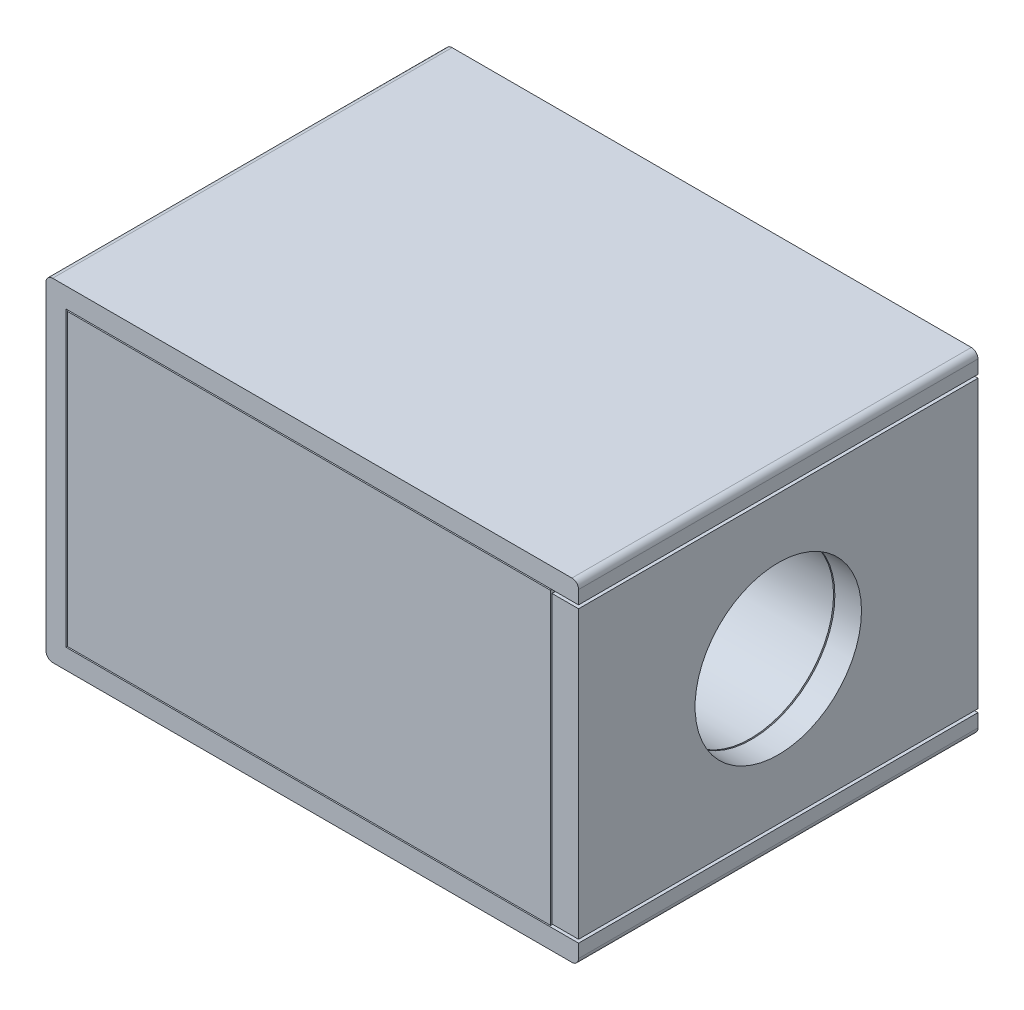
ISO-10303-21;
HEADER;
FILE_DESCRIPTION(('STEP AP214'),'2;1');
FILE_NAME('part.step','',(''),(''),'','','');
FILE_SCHEMA(('AUTOMOTIVE_DESIGN { 1 0 10303 214 1 1 1 1 }'));
ENDSEC;
DATA;
#1=APPLICATION_CONTEXT('core data for automotive mechanical design processes');
#2=APPLICATION_PROTOCOL_DEFINITION('international standard','automotive_design',2000,#1);
#3=PRODUCT_CONTEXT('',#1,'mechanical');
#4=PRODUCT('Part','Part','',(#3));
#5=PRODUCT_RELATED_PRODUCT_CATEGORY('part','',(#4));
#6=PRODUCT_DEFINITION_FORMATION('','',#4);
#7=PRODUCT_DEFINITION_CONTEXT('part definition',#1,'design');
#8=PRODUCT_DEFINITION('design','',#6,#7);
#9=PRODUCT_DEFINITION_SHAPE('','',#8);
#10=(LENGTH_UNIT() NAMED_UNIT(*) SI_UNIT(.MILLI.,.METRE.));
#11=(NAMED_UNIT(*) PLANE_ANGLE_UNIT() SI_UNIT($,.RADIAN.));
#12=(NAMED_UNIT(*) SI_UNIT($,.STERADIAN.) SOLID_ANGLE_UNIT());
#13=UNCERTAINTY_MEASURE_WITH_UNIT(LENGTH_MEASURE(1.E-05),#10,'distance_accuracy_value','');
#14=(GEOMETRIC_REPRESENTATION_CONTEXT(3) GLOBAL_UNCERTAINTY_ASSIGNED_CONTEXT((#13)) GLOBAL_UNIT_ASSIGNED_CONTEXT((#10,
#11,#12)) REPRESENTATION_CONTEXT('',''));
#15=CARTESIAN_POINT('',(0.,0.,0.));
#16=DIRECTION('',(0.,0.,1.));
#17=DIRECTION('',(1.,0.,0.));
#18=AXIS2_PLACEMENT_3D('',#15,#16,#17);
#19=CARTESIAN_POINT('',(79.,-24.,0.));
#20=DIRECTION('',(0.,0.,-1.));
#21=DIRECTION('',(-1.,0.,0.));
#22=AXIS2_PLACEMENT_3D('',#19,#20,#21);
#23=PLANE('',#22);
#24=DIRECTION('',(0.,-1.,0.));
#25=VECTOR('',#24,1.);
#26=CARTESIAN_POINT('',(3.2,21.8,0.));
#27=LINE('',#26,#25);
#28=CARTESIAN_POINT('',(3.2,21.8,0.));
#29=VERTEX_POINT('',#28);
#30=CARTESIAN_POINT('',(3.20000000000001,-21.8,0.));
#31=VERTEX_POINT('',#30);
#32=EDGE_CURVE('E56',#29,#31,#27,.T.);
#33=ORIENTED_EDGE('',*,*,#32,.F.);
#34=DIRECTION('',(-1.,0.,0.));
#35=VECTOR('',#34,1.);
#36=CARTESIAN_POINT('',(3.2,21.8,0.));
#37=LINE('',#36,#35);
#38=CARTESIAN_POINT('',(75.8,21.8,0.));
#39=VERTEX_POINT('',#38);
#40=EDGE_CURVE('E80',#39,#29,#37,.T.);
#41=ORIENTED_EDGE('',*,*,#40,.F.);
#42=DIRECTION('',(0.,1.,0.));
#43=VECTOR('',#42,1.);
#44=CARTESIAN_POINT('',(75.8,21.8,0.));
#45=LINE('',#44,#43);
#46=CARTESIAN_POINT('',(75.8,-21.8,0.));
#47=VERTEX_POINT('',#46);
#48=EDGE_CURVE('E85',#47,#39,#45,.T.);
#49=ORIENTED_EDGE('',*,*,#48,.F.);
#50=DIRECTION('',(1.,0.,0.));
#51=VECTOR('',#50,1.);
#52=CARTESIAN_POINT('',(3.20000000000001,-21.8,0.));
#53=LINE('',#52,#51);
#54=EDGE_CURVE('E100',#31,#47,#53,.T.);
#55=ORIENTED_EDGE('',*,*,#54,.F.);
#56=EDGE_LOOP('',(#33,#41,#49,#55));
#57=FACE_BOUND('',#56,.T.);
#58=ADVANCED_FACE('F47',(#57),#23,.T.);
#59=CARTESIAN_POINT('',(0.,0.,60.));
#60=DIRECTION('',(0.,0.,1.));
#61=DIRECTION('',(1.,0.,0.));
#62=AXIS2_PLACEMENT_3D('',#59,#60,#61);
#63=PLANE('',#62);
#64=DIRECTION('',(0.,-1.,0.));
#65=VECTOR('',#64,1.);
#66=CARTESIAN_POINT('',(3.2,21.8,60.));
#67=LINE('',#66,#65);
#68=CARTESIAN_POINT('',(3.2,21.8,60.));
#69=VERTEX_POINT('',#68);
#70=CARTESIAN_POINT('',(3.20000000000001,-21.8,60.));
#71=VERTEX_POINT('',#70);
#72=EDGE_CURVE('E110',#69,#71,#67,.T.);
#73=ORIENTED_EDGE('',*,*,#72,.T.);
#74=DIRECTION('',(1.,0.,0.));
#75=VECTOR('',#74,1.);
#76=CARTESIAN_POINT('',(3.20000000000001,-21.8,60.));
#77=LINE('',#76,#75);
#78=CARTESIAN_POINT('',(75.8,-21.8,60.));
#79=VERTEX_POINT('',#78);
#80=EDGE_CURVE('E98',#71,#79,#77,.T.);
#81=ORIENTED_EDGE('',*,*,#80,.T.);
#82=DIRECTION('',(0.,1.,0.));
#83=VECTOR('',#82,1.);
#84=CARTESIAN_POINT('',(75.8,21.8,60.));
#85=LINE('',#84,#83);
#86=CARTESIAN_POINT('',(75.8,21.8,60.));
#87=VERTEX_POINT('',#86);
#88=EDGE_CURVE('E102',#79,#87,#85,.T.);
#89=ORIENTED_EDGE('',*,*,#88,.T.);
#90=DIRECTION('',(-1.,0.,0.));
#91=VECTOR('',#90,1.);
#92=CARTESIAN_POINT('',(3.2,21.8,60.));
#93=LINE('',#92,#91);
#94=EDGE_CURVE('E107',#87,#69,#93,.T.);
#95=ORIENTED_EDGE('',*,*,#94,.T.);
#96=EDGE_LOOP('',(#73,#81,#89,#95));
#97=FACE_BOUND('',#96,.T.);
#98=ADVANCED_FACE('F109',(#97),#63,.T.);
#99=CARTESIAN_POINT('',(3.20000000000001,-21.8,-84.6860082894453));
#100=DIRECTION('',(0.,-1.,0.));
#101=DIRECTION('',(0.,0.,-1.));
#102=AXIS2_PLACEMENT_3D('',#99,#100,#101);
#103=PLANE('',#102);
#104=CARTESIAN_POINT('',(17.,-21.8,48.5));
#105=DIRECTION('',(0.,-1.,0.));
#106=DIRECTION('',(0.,0.,-1.));
#107=AXIS2_PLACEMENT_3D('',#104,#105,#106);
#108=CIRCLE('',#107,2.);
#109=CARTESIAN_POINT('',(17.,-21.8,46.5));
#110=VERTEX_POINT('',#109);
#111=EDGE_CURVE('E112',#110,#110,#108,.T.);
#112=ORIENTED_EDGE('',*,*,#111,.F.);
#113=EDGE_LOOP('',(#112));
#114=FACE_BOUND('',#113,.T.);
#115=CARTESIAN_POINT('',(45.,-21.8,48.5));
#116=DIRECTION('',(0.,-1.,0.));
#117=DIRECTION('',(0.,0.,-1.));
#118=AXIS2_PLACEMENT_3D('',#115,#116,#117);
#119=CIRCLE('',#118,2.);
#120=CARTESIAN_POINT('',(45.,-21.8,46.5));
#121=VERTEX_POINT('',#120);
#122=EDGE_CURVE('E130',#121,#121,#119,.T.);
#123=ORIENTED_EDGE('',*,*,#122,.F.);
#124=EDGE_LOOP('',(#123));
#125=FACE_BOUND('',#124,.T.);
#126=CARTESIAN_POINT('',(45.,-21.8,11.5));
#127=DIRECTION('',(0.,-1.,0.));
#128=DIRECTION('',(0.,0.,-1.));
#129=AXIS2_PLACEMENT_3D('',#126,#127,#128);
#130=CIRCLE('',#129,2.);
#131=CARTESIAN_POINT('',(45.,-21.8,9.5));
#132=VERTEX_POINT('',#131);
#133=EDGE_CURVE('E126',#132,#132,#130,.T.);
#134=ORIENTED_EDGE('',*,*,#133,.F.);
#135=EDGE_LOOP('',(#134));
#136=FACE_BOUND('',#135,.T.);
#137=CARTESIAN_POINT('',(17.,-21.8,11.5));
#138=DIRECTION('',(0.,-1.,0.));
#139=DIRECTION('',(0.,0.,-1.));
#140=AXIS2_PLACEMENT_3D('',#137,#138,#139);
#141=CIRCLE('',#140,2.);
#142=CARTESIAN_POINT('',(17.,-21.8,9.5));
#143=VERTEX_POINT('',#142);
#144=EDGE_CURVE('E123',#143,#143,#141,.T.);
#145=ORIENTED_EDGE('',*,*,#144,.F.);
#146=EDGE_LOOP('',(#145));
#147=FACE_BOUND('',#146,.T.);
#148=DIRECTION('',(0.,0.,1.));
#149=VECTOR('',#148,1.);
#150=CARTESIAN_POINT('',(3.20000000000001,-21.8,-84.6860082894453));
#151=LINE('',#150,#149);
#152=EDGE_CURVE('E12',#31,#71,#151,.T.);
#153=ORIENTED_EDGE('',*,*,#152,.F.);
#154=ORIENTED_EDGE('',*,*,#54,.T.);
#155=DIRECTION('',(0.,0.,1.));
#156=VECTOR('',#155,1.);
#157=CARTESIAN_POINT('',(75.8,-21.8,-84.6860082894453));
#158=LINE('',#157,#156);
#159=EDGE_CURVE('E95',#47,#79,#158,.T.);
#160=ORIENTED_EDGE('',*,*,#159,.T.);
#161=ORIENTED_EDGE('',*,*,#80,.F.);
#162=EDGE_LOOP('',(#153,#154,#160,#161));
#163=FACE_BOUND('',#162,.T.);
#164=ADVANCED_FACE('F96',(#114,#125,#136,#147,#163),#103,.T.);
#165=CARTESIAN_POINT('',(75.8,21.8,-84.6860082894453));
#166=DIRECTION('',(1.,0.,0.));
#167=DIRECTION('',(0.,0.,-1.));
#168=AXIS2_PLACEMENT_3D('',#165,#166,#167);
#169=PLANE('',#168);
#170=CARTESIAN_POINT('',(75.8,0.,30.));
#171=DIRECTION('',(1.,0.,0.));
#172=DIRECTION('',(0.,0.,-1.));
#173=AXIS2_PLACEMENT_3D('',#170,#171,#172);
#174=CIRCLE('',#173,12.5);
#175=CARTESIAN_POINT('',(75.8,0.,17.5));
#176=VERTEX_POINT('',#175);
#177=EDGE_CURVE('E134',#176,#176,#174,.T.);
#178=ORIENTED_EDGE('',*,*,#177,.F.);
#179=EDGE_LOOP('',(#178));
#180=FACE_BOUND('',#179,.T.);
#181=ORIENTED_EDGE('',*,*,#159,.F.);
#182=ORIENTED_EDGE('',*,*,#48,.T.);
#183=DIRECTION('',(0.,0.,1.));
#184=VECTOR('',#183,1.);
#185=CARTESIAN_POINT('',(75.8,21.8,-84.6860082894453));
#186=LINE('',#185,#184);
#187=EDGE_CURVE('E90',#39,#87,#186,.T.);
#188=ORIENTED_EDGE('',*,*,#187,.T.);
#189=ORIENTED_EDGE('',*,*,#88,.F.);
#190=EDGE_LOOP('',(#181,#182,#188,#189));
#191=FACE_BOUND('',#190,.T.);
#192=ADVANCED_FACE('F103',(#180,#191),#169,.T.);
#193=CARTESIAN_POINT('',(3.2,21.8,-84.6860082894453));
#194=DIRECTION('',(0.,1.,0.));
#195=DIRECTION('',(0.,0.,1.));
#196=AXIS2_PLACEMENT_3D('',#193,#194,#195);
#197=PLANE('',#196);
#198=ORIENTED_EDGE('',*,*,#187,.F.);
#199=ORIENTED_EDGE('',*,*,#40,.T.);
#200=DIRECTION('',(0.,0.,1.));
#201=VECTOR('',#200,1.);
#202=CARTESIAN_POINT('',(3.2,21.8,-84.6860082894453));
#203=LINE('',#202,#201);
#204=EDGE_CURVE('E118',#29,#69,#203,.T.);
#205=ORIENTED_EDGE('',*,*,#204,.T.);
#206=ORIENTED_EDGE('',*,*,#94,.F.);
#207=EDGE_LOOP('',(#198,#199,#205,#206));
#208=FACE_BOUND('',#207,.T.);
#209=ADVANCED_FACE('F158',(#208),#197,.T.);
#210=CARTESIAN_POINT('',(3.2,21.8,-84.6860082894453));
#211=DIRECTION('',(-1.,0.,0.));
#212=DIRECTION('',(0.,-1.,0.));
#213=AXIS2_PLACEMENT_3D('',#210,#211,#212);
#214=PLANE('',#213);
#215=CARTESIAN_POINT('',(3.2,0.,30.));
#216=DIRECTION('',(-1.,0.,0.));
#217=DIRECTION('',(0.,-1.,0.));
#218=AXIS2_PLACEMENT_3D('',#215,#216,#217);
#219=CIRCLE('',#218,5.);
#220=CARTESIAN_POINT('',(3.2,-5.,30.));
#221=VERTEX_POINT('',#220);
#222=EDGE_CURVE('E144',#221,#221,#219,.T.);
#223=ORIENTED_EDGE('',*,*,#222,.F.);
#224=EDGE_LOOP('',(#223));
#225=FACE_BOUND('',#224,.T.);
#226=ORIENTED_EDGE('',*,*,#204,.F.);
#227=ORIENTED_EDGE('',*,*,#32,.T.);
#228=ORIENTED_EDGE('',*,*,#152,.T.);
#229=ORIENTED_EDGE('',*,*,#72,.F.);
#230=EDGE_LOOP('',(#226,#227,#228,#229));
#231=FACE_BOUND('',#230,.T.);
#232=ADVANCED_FACE('F160',(#225,#231),#214,.T.);
#233=CARTESIAN_POINT('',(17.,3.00000000000001,11.5));
#234=DIRECTION('',(0.,-1.,0.));
#235=DIRECTION('',(1.,0.,0.));
#236=AXIS2_PLACEMENT_3D('',#233,#234,#235);
#237=CYLINDRICAL_SURFACE('',#236,2.);
#238=ORIENTED_EDGE('',*,*,#144,.T.);
#239=EDGE_LOOP('',(#238));
#240=FACE_BOUND('',#239,.T.);
#241=CARTESIAN_POINT('',(17.,3.00000000000001,11.5));
#242=DIRECTION('',(0.,-1.,0.));
#243=DIRECTION('',(1.,0.,0.));
#244=AXIS2_PLACEMENT_3D('',#241,#242,#243);
#245=CIRCLE('',#244,2.);
#246=CARTESIAN_POINT('',(19.,3.00000000000001,11.5));
#247=VERTEX_POINT('',#246);
#248=EDGE_CURVE('E136',#247,#247,#245,.T.);
#249=ORIENTED_EDGE('',*,*,#248,.F.);
#250=EDGE_LOOP('',(#249));
#251=FACE_BOUND('',#250,.T.);
#252=ADVANCED_FACE('F162',(#240,#251),#237,.F.);
#253=CARTESIAN_POINT('',(17.,3.00000000000001,11.5));
#254=DIRECTION('',(0.,-1.,0.));
#255=DIRECTION('',(1.,0.,0.));
#256=AXIS2_PLACEMENT_3D('',#253,#254,#255);
#257=PLANE('',#256);
#258=ORIENTED_EDGE('',*,*,#248,.T.);
#259=EDGE_LOOP('',(#258));
#260=FACE_BOUND('',#259,.T.);
#261=ADVANCED_FACE('F169',(#260),#257,.T.);
#262=CARTESIAN_POINT('',(45.,3.00000000000001,11.5));
#263=DIRECTION('',(0.,-1.,0.));
#264=DIRECTION('',(1.,0.,0.));
#265=AXIS2_PLACEMENT_3D('',#262,#263,#264);
#266=CYLINDRICAL_SURFACE('',#265,2.);
#267=ORIENTED_EDGE('',*,*,#133,.T.);
#268=EDGE_LOOP('',(#267));
#269=FACE_BOUND('',#268,.T.);
#270=CARTESIAN_POINT('',(45.,3.00000000000001,11.5));
#271=DIRECTION('',(0.,-1.,0.));
#272=DIRECTION('',(1.,0.,0.));
#273=AXIS2_PLACEMENT_3D('',#270,#271,#272);
#274=CIRCLE('',#273,2.);
#275=CARTESIAN_POINT('',(47.,3.00000000000001,11.5));
#276=VERTEX_POINT('',#275);
#277=EDGE_CURVE('E141',#276,#276,#274,.T.);
#278=ORIENTED_EDGE('',*,*,#277,.F.);
#279=EDGE_LOOP('',(#278));
#280=FACE_BOUND('',#279,.T.);
#281=ADVANCED_FACE('F186',(#269,#280),#266,.F.);
#282=CARTESIAN_POINT('',(45.,3.00000000000001,11.5));
#283=DIRECTION('',(0.,-1.,0.));
#284=DIRECTION('',(1.,0.,0.));
#285=AXIS2_PLACEMENT_3D('',#282,#283,#284);
#286=PLANE('',#285);
#287=ORIENTED_EDGE('',*,*,#277,.T.);
#288=EDGE_LOOP('',(#287));
#289=FACE_BOUND('',#288,.T.);
#290=ADVANCED_FACE('F190',(#289),#286,.T.);
#291=CARTESIAN_POINT('',(45.,3.00000000000001,48.5));
#292=DIRECTION('',(0.,-1.,0.));
#293=DIRECTION('',(1.,0.,0.));
#294=AXIS2_PLACEMENT_3D('',#291,#292,#293);
#295=CYLINDRICAL_SURFACE('',#294,2.);
#296=ORIENTED_EDGE('',*,*,#122,.T.);
#297=EDGE_LOOP('',(#296));
#298=FACE_BOUND('',#297,.T.);
#299=CARTESIAN_POINT('',(45.,3.00000000000001,48.5));
#300=DIRECTION('',(0.,-1.,0.));
#301=DIRECTION('',(1.,0.,0.));
#302=AXIS2_PLACEMENT_3D('',#299,#300,#301);
#303=CIRCLE('',#302,2.);
#304=CARTESIAN_POINT('',(47.,3.00000000000001,48.5));
#305=VERTEX_POINT('',#304);
#306=EDGE_CURVE('E153',#305,#305,#303,.T.);
#307=ORIENTED_EDGE('',*,*,#306,.F.);
#308=EDGE_LOOP('',(#307));
#309=FACE_BOUND('',#308,.T.);
#310=ADVANCED_FACE('F194',(#298,#309),#295,.F.);
#311=CARTESIAN_POINT('',(45.,3.00000000000001,48.5));
#312=DIRECTION('',(0.,-1.,0.));
#313=DIRECTION('',(1.,0.,0.));
#314=AXIS2_PLACEMENT_3D('',#311,#312,#313);
#315=PLANE('',#314);
#316=ORIENTED_EDGE('',*,*,#306,.T.);
#317=EDGE_LOOP('',(#316));
#318=FACE_BOUND('',#317,.T.);
#319=ADVANCED_FACE('F198',(#318),#315,.T.);
#320=CARTESIAN_POINT('',(17.,3.00000000000001,48.5));
#321=DIRECTION('',(0.,-1.,0.));
#322=DIRECTION('',(1.,0.,0.));
#323=AXIS2_PLACEMENT_3D('',#320,#321,#322);
#324=CYLINDRICAL_SURFACE('',#323,2.);
#325=ORIENTED_EDGE('',*,*,#111,.T.);
#326=EDGE_LOOP('',(#325));
#327=FACE_BOUND('',#326,.T.);
#328=CARTESIAN_POINT('',(17.,3.00000000000001,48.5));
#329=DIRECTION('',(0.,-1.,0.));
#330=DIRECTION('',(1.,0.,0.));
#331=AXIS2_PLACEMENT_3D('',#328,#329,#330);
#332=CIRCLE('',#331,2.);
#333=CARTESIAN_POINT('',(19.,3.00000000000001,48.5));
#334=VERTEX_POINT('',#333);
#335=EDGE_CURVE('E127',#334,#334,#332,.T.);
#336=ORIENTED_EDGE('',*,*,#335,.F.);
#337=EDGE_LOOP('',(#336));
#338=FACE_BOUND('',#337,.T.);
#339=ADVANCED_FACE('F202',(#327,#338),#324,.F.);
#340=CARTESIAN_POINT('',(17.,3.00000000000001,48.5));
#341=DIRECTION('',(0.,-1.,0.));
#342=DIRECTION('',(1.,0.,0.));
#343=AXIS2_PLACEMENT_3D('',#340,#341,#342);
#344=PLANE('',#343);
#345=ORIENTED_EDGE('',*,*,#335,.T.);
#346=EDGE_LOOP('',(#345));
#347=FACE_BOUND('',#346,.T.);
#348=ADVANCED_FACE('F206',(#347),#344,.T.);
#349=CARTESIAN_POINT('',(20.,0.,30.));
#350=DIRECTION('',(1.,0.,0.));
#351=DIRECTION('',(0.,0.,-1.));
#352=AXIS2_PLACEMENT_3D('',#349,#350,#351);
#353=CYLINDRICAL_SURFACE('',#352,12.5);
#354=ORIENTED_EDGE('',*,*,#177,.T.);
#355=EDGE_LOOP('',(#354));
#356=FACE_BOUND('',#355,.T.);
#357=CARTESIAN_POINT('',(20.,0.,30.));
#358=DIRECTION('',(1.,0.,0.));
#359=DIRECTION('',(0.,0.,-1.));
#360=AXIS2_PLACEMENT_3D('',#357,#358,#359);
#361=CIRCLE('',#360,12.5);
#362=CARTESIAN_POINT('',(20.,0.,17.5));
#363=VERTEX_POINT('',#362);
#364=EDGE_CURVE('E137',#363,#363,#361,.T.);
#365=ORIENTED_EDGE('',*,*,#364,.F.);
#366=EDGE_LOOP('',(#365));
#367=FACE_BOUND('',#366,.T.);
#368=ADVANCED_FACE('F210',(#356,#367),#353,.F.);
#369=CARTESIAN_POINT('',(20.,0.,30.));
#370=DIRECTION('',(1.,0.,0.));
#371=DIRECTION('',(0.,0.,-1.));
#372=AXIS2_PLACEMENT_3D('',#369,#370,#371);
#373=PLANE('',#372);
#374=CARTESIAN_POINT('',(20.,0.,30.));
#375=DIRECTION('',(1.,0.,0.));
#376=DIRECTION('',(0.,0.,-1.));
#377=AXIS2_PLACEMENT_3D('',#374,#375,#376);
#378=CIRCLE('',#377,5.);
#379=CARTESIAN_POINT('',(20.,0.,25.));
#380=VERTEX_POINT('',#379);
#381=EDGE_CURVE('E50',#380,#380,#378,.T.);
#382=ORIENTED_EDGE('',*,*,#381,.F.);
#383=EDGE_LOOP('',(#382));
#384=FACE_BOUND('',#383,.T.);
#385=ORIENTED_EDGE('',*,*,#364,.T.);
#386=EDGE_LOOP('',(#385));
#387=FACE_BOUND('',#386,.T.);
#388=ADVANCED_FACE('F214',(#384,#387),#373,.T.);
#389=CARTESIAN_POINT('',(42.,0.,30.));
#390=DIRECTION('',(-1.,0.,0.));
#391=DIRECTION('',(0.,-1.,0.));
#392=AXIS2_PLACEMENT_3D('',#389,#390,#391);
#393=CYLINDRICAL_SURFACE('',#392,5.);
#394=ORIENTED_EDGE('',*,*,#222,.T.);
#395=EDGE_LOOP('',(#394));
#396=FACE_BOUND('',#395,.T.);
#397=ORIENTED_EDGE('',*,*,#381,.T.);
#398=EDGE_LOOP('',(#397));
#399=FACE_BOUND('',#398,.T.);
#400=ADVANCED_FACE('F217',(#396,#399),#393,.F.);
#401=CLOSED_SHELL('',(#58,#98,#164,#192,#209,#232,#252,#261,#281,#290,#310,#319,#339,#348,#368,
#388,#400));
#402=MANIFOLD_SOLID_BREP('B2',#401);
#403=CARTESIAN_POINT('',(76.,21.5,60.));
#404=DIRECTION('',(0.,0.,1.));
#405=DIRECTION('',(1.,0.,0.));
#406=AXIS2_PLACEMENT_3D('',#403,#404,#405);
#407=PLANE('',#406);
#408=DIRECTION('',(0.,-1.,0.));
#409=VECTOR('',#408,1.);
#410=CARTESIAN_POINT('',(80.,21.5,60.));
#411=LINE('',#410,#409);
#412=CARTESIAN_POINT('',(80.,21.5,60.));
#413=VERTEX_POINT('',#412);
#414=CARTESIAN_POINT('',(80.,-21.5,60.));
#415=VERTEX_POINT('',#414);
#416=EDGE_CURVE('E415',#413,#415,#411,.T.);
#417=ORIENTED_EDGE('',*,*,#416,.F.);
#418=DIRECTION('',(1.,0.,0.));
#419=VECTOR('',#418,1.);
#420=CARTESIAN_POINT('',(76.,21.5,60.));
#421=LINE('',#420,#419);
#422=CARTESIAN_POINT('',(76.,21.5,60.));
#423=VERTEX_POINT('',#422);
#424=EDGE_CURVE('E45',#423,#413,#421,.T.);
#425=ORIENTED_EDGE('',*,*,#424,.F.);
#426=DIRECTION('',(0.,-1.,0.));
#427=VECTOR('',#426,1.);
#428=CARTESIAN_POINT('',(76.,21.5,60.));
#429=LINE('',#428,#427);
#430=CARTESIAN_POINT('',(76.,-21.5,60.));
#431=VERTEX_POINT('',#430);
#432=EDGE_CURVE('E408',#423,#431,#429,.T.);
#433=ORIENTED_EDGE('',*,*,#432,.T.);
#434=DIRECTION('',(1.,0.,0.));
#435=VECTOR('',#434,1.);
#436=CARTESIAN_POINT('',(76.,-21.5,60.));
#437=LINE('',#436,#435);
#438=EDGE_CURVE('E353',#431,#415,#437,.T.);
#439=ORIENTED_EDGE('',*,*,#438,.T.);
#440=EDGE_LOOP('',(#417,#425,#433,#439));
#441=FACE_BOUND('',#440,.T.);
#442=ADVANCED_FACE('F350',(#441),#407,.T.);
#443=CARTESIAN_POINT('',(76.,21.5,60.));
#444=DIRECTION('',(0.,1.,0.));
#445=DIRECTION('',(0.,0.,1.));
#446=AXIS2_PLACEMENT_3D('',#443,#444,#445);
#447=PLANE('',#446);
#448=DIRECTION('',(0.,0.,1.));
#449=VECTOR('',#448,1.);
#450=CARTESIAN_POINT('',(80.,21.5,60.));
#451=LINE('',#450,#449);
#452=CARTESIAN_POINT('',(80.,21.5,0.));
#453=VERTEX_POINT('',#452);
#454=EDGE_CURVE('E410',#453,#413,#451,.T.);
#455=ORIENTED_EDGE('',*,*,#454,.F.);
#456=DIRECTION('',(1.,0.,0.));
#457=VECTOR('',#456,1.);
#458=CARTESIAN_POINT('',(76.,21.5,0.));
#459=LINE('',#458,#457);
#460=CARTESIAN_POINT('',(76.,21.5,0.));
#461=VERTEX_POINT('',#460);
#462=EDGE_CURVE('E359',#461,#453,#459,.T.);
#463=ORIENTED_EDGE('',*,*,#462,.F.);
#464=DIRECTION('',(0.,0.,1.));
#465=VECTOR('',#464,1.);
#466=CARTESIAN_POINT('',(76.,21.5,60.));
#467=LINE('',#466,#465);
#468=EDGE_CURVE('E405',#461,#423,#467,.T.);
#469=ORIENTED_EDGE('',*,*,#468,.T.);
#470=ORIENTED_EDGE('',*,*,#424,.T.);
#471=EDGE_LOOP('',(#455,#463,#469,#470));
#472=FACE_BOUND('',#471,.T.);
#473=ADVANCED_FACE('F426',(#472),#447,.T.);
#474=CARTESIAN_POINT('',(76.,21.5,0.));
#475=DIRECTION('',(0.,0.,-1.));
#476=DIRECTION('',(-1.,0.,0.));
#477=AXIS2_PLACEMENT_3D('',#474,#475,#476);
#478=PLANE('',#477);
#479=DIRECTION('',(0.,1.,0.));
#480=VECTOR('',#479,1.);
#481=CARTESIAN_POINT('',(80.,21.5,0.));
#482=LINE('',#481,#480);
#483=CARTESIAN_POINT('',(80.,-21.5,0.));
#484=VERTEX_POINT('',#483);
#485=EDGE_CURVE('E400',#484,#453,#482,.T.);
#486=ORIENTED_EDGE('',*,*,#485,.F.);
#487=DIRECTION('',(1.,0.,0.));
#488=VECTOR('',#487,1.);
#489=CARTESIAN_POINT('',(76.,-21.5,0.));
#490=LINE('',#489,#488);
#491=CARTESIAN_POINT('',(76.,-21.5,0.));
#492=VERTEX_POINT('',#491);
#493=EDGE_CURVE('E395',#492,#484,#490,.T.);
#494=ORIENTED_EDGE('',*,*,#493,.F.);
#495=DIRECTION('',(0.,1.,0.));
#496=VECTOR('',#495,1.);
#497=CARTESIAN_POINT('',(76.,21.5,0.));
#498=LINE('',#497,#496);
#499=EDGE_CURVE('E398',#492,#461,#498,.T.);
#500=ORIENTED_EDGE('',*,*,#499,.T.);
#501=ORIENTED_EDGE('',*,*,#462,.T.);
#502=EDGE_LOOP('',(#486,#494,#500,#501));
#503=FACE_BOUND('',#502,.T.);
#504=ADVANCED_FACE('F397',(#503),#478,.T.);
#505=CARTESIAN_POINT('',(76.,-21.5,60.));
#506=DIRECTION('',(0.,-1.,0.));
#507=DIRECTION('',(0.,0.,-1.));
#508=AXIS2_PLACEMENT_3D('',#505,#506,#507);
#509=PLANE('',#508);
#510=DIRECTION('',(0.,0.,-1.));
#511=VECTOR('',#510,1.);
#512=CARTESIAN_POINT('',(80.,-21.5,60.));
#513=LINE('',#512,#511);
#514=EDGE_CURVE('E418',#415,#484,#513,.T.);
#515=ORIENTED_EDGE('',*,*,#514,.F.);
#516=ORIENTED_EDGE('',*,*,#438,.F.);
#517=DIRECTION('',(0.,0.,-1.));
#518=VECTOR('',#517,1.);
#519=CARTESIAN_POINT('',(76.,-21.5,60.));
#520=LINE('',#519,#518);
#521=EDGE_CURVE('E404',#431,#492,#520,.T.);
#522=ORIENTED_EDGE('',*,*,#521,.T.);
#523=ORIENTED_EDGE('',*,*,#493,.T.);
#524=EDGE_LOOP('',(#515,#516,#522,#523));
#525=FACE_BOUND('',#524,.T.);
#526=ADVANCED_FACE('F407',(#525),#509,.T.);
#527=CARTESIAN_POINT('',(76.,0.,0.));
#528=DIRECTION('',(1.,0.,0.));
#529=DIRECTION('',(0.,0.,-1.));
#530=AXIS2_PLACEMENT_3D('',#527,#528,#529);
#531=PLANE('',#530);
#532=CARTESIAN_POINT('',(76.,0.,30.));
#533=DIRECTION('',(1.,0.,0.));
#534=DIRECTION('',(0.,0.,-1.));
#535=AXIS2_PLACEMENT_3D('',#532,#533,#534);
#536=CIRCLE('',#535,12.5);
#537=CARTESIAN_POINT('',(76.,0.,17.5));
#538=VERTEX_POINT('',#537);
#539=EDGE_CURVE('E419',#538,#538,#536,.T.);
#540=ORIENTED_EDGE('',*,*,#539,.T.);
#541=EDGE_LOOP('',(#540));
#542=FACE_BOUND('',#541,.T.);
#543=ORIENTED_EDGE('',*,*,#432,.F.);
#544=ORIENTED_EDGE('',*,*,#468,.F.);
#545=ORIENTED_EDGE('',*,*,#499,.F.);
#546=ORIENTED_EDGE('',*,*,#521,.F.);
#547=EDGE_LOOP('',(#543,#544,#545,#546));
#548=FACE_BOUND('',#547,.T.);
#549=ADVANCED_FACE('F403',(#542,#548),#531,.F.);
#550=CARTESIAN_POINT('',(80.,0.,0.));
#551=DIRECTION('',(1.,0.,0.));
#552=DIRECTION('',(0.,0.,-1.));
#553=AXIS2_PLACEMENT_3D('',#550,#551,#552);
#554=PLANE('',#553);
#555=CARTESIAN_POINT('',(80.,0.,30.));
#556=DIRECTION('',(1.,0.,0.));
#557=DIRECTION('',(0.,0.,-1.));
#558=AXIS2_PLACEMENT_3D('',#555,#556,#557);
#559=CIRCLE('',#558,12.5);
#560=CARTESIAN_POINT('',(80.,0.,17.5));
#561=VERTEX_POINT('',#560);
#562=EDGE_CURVE('E455',#561,#561,#559,.T.);
#563=ORIENTED_EDGE('',*,*,#562,.F.);
#564=EDGE_LOOP('',(#563));
#565=FACE_BOUND('',#564,.T.);
#566=ORIENTED_EDGE('',*,*,#416,.T.);
#567=ORIENTED_EDGE('',*,*,#514,.T.);
#568=ORIENTED_EDGE('',*,*,#485,.T.);
#569=ORIENTED_EDGE('',*,*,#454,.T.);
#570=EDGE_LOOP('',(#566,#567,#568,#569));
#571=FACE_BOUND('',#570,.T.);
#572=ADVANCED_FACE('F425',(#565,#571),#554,.T.);
#573=CARTESIAN_POINT('',(20.,0.,30.));
#574=DIRECTION('',(1.,0.,0.));
#575=DIRECTION('',(0.,0.,-1.));
#576=AXIS2_PLACEMENT_3D('',#573,#574,#575);
#577=CYLINDRICAL_SURFACE('',#576,12.5);
#578=ORIENTED_EDGE('',*,*,#562,.T.);
#579=EDGE_LOOP('',(#578));
#580=FACE_BOUND('',#579,.T.);
#581=ORIENTED_EDGE('',*,*,#539,.F.);
#582=EDGE_LOOP('',(#581));
#583=FACE_BOUND('',#582,.T.);
#584=ADVANCED_FACE('F444',(#580,#583),#577,.F.);
#585=CLOSED_SHELL('',(#442,#473,#504,#526,#549,#572,#584));
#586=MANIFOLD_SOLID_BREP('B6',#585);
#587=CARTESIAN_POINT('',(79.,-24.,60.));
#588=DIRECTION('',(0.,0.,-1.));
#589=DIRECTION('',(-1.,0.,0.));
#590=AXIS2_PLACEMENT_3D('',#587,#588,#589);
#591=CYLINDRICAL_SURFACE('',#590,1.);
#592=CARTESIAN_POINT('',(79.,-24.,0.));
#593=DIRECTION('',(0.,0.,1.));
#594=DIRECTION('',(-1.,0.,0.));
#595=AXIS2_PLACEMENT_3D('',#592,#593,#594);
#596=CIRCLE('',#595,1.);
#597=CARTESIAN_POINT('',(79.,-25.,0.));
#598=VERTEX_POINT('',#597);
#599=CARTESIAN_POINT('',(80.,-24.,0.));
#600=VERTEX_POINT('',#599);
#601=EDGE_CURVE('E614',#598,#600,#596,.T.);
#602=ORIENTED_EDGE('',*,*,#601,.T.);
#603=DIRECTION('',(0.,0.,-1.));
#604=VECTOR('',#603,1.);
#605=CARTESIAN_POINT('',(80.,-24.,60.));
#606=LINE('',#605,#604);
#607=CARTESIAN_POINT('',(80.,-24.,60.));
#608=VERTEX_POINT('',#607);
#609=EDGE_CURVE('E348',#608,#600,#606,.T.);
#610=ORIENTED_EDGE('',*,*,#609,.F.);
#611=CARTESIAN_POINT('',(79.,-24.,60.));
#612=DIRECTION('',(0.,0.,1.));
#613=DIRECTION('',(-1.,0.,0.));
#614=AXIS2_PLACEMENT_3D('',#611,#612,#613);
#615=CIRCLE('',#614,1.);
#616=CARTESIAN_POINT('',(79.,-25.,60.));
#617=VERTEX_POINT('',#616);
#618=EDGE_CURVE('E637',#617,#608,#615,.T.);
#619=ORIENTED_EDGE('',*,*,#618,.F.);
#620=DIRECTION('',(0.,0.,-1.));
#621=VECTOR('',#620,1.);
#622=CARTESIAN_POINT('',(79.,-25.,60.));
#623=LINE('',#622,#621);
#624=EDGE_CURVE('E610',#617,#598,#623,.T.);
#625=ORIENTED_EDGE('',*,*,#624,.T.);
#626=EDGE_LOOP('',(#602,#610,#619,#625));
#627=FACE_BOUND('',#626,.T.);
#628=ADVANCED_FACE('F494',(#627),#591,.T.);
#629=CARTESIAN_POINT('',(80.,-22.,60.));
#630=DIRECTION('',(-1.,0.,0.));
#631=DIRECTION('',(0.,0.,1.));
#632=AXIS2_PLACEMENT_3D('',#629,#630,#631);
#633=PLANE('',#632);
#634=DIRECTION('',(0.,1.,0.));
#635=VECTOR('',#634,1.);
#636=CARTESIAN_POINT('',(80.,-22.,0.));
#637=LINE('',#636,#635);
#638=CARTESIAN_POINT('',(80.,-22.,0.));
#639=VERTEX_POINT('',#638);
#640=EDGE_CURVE('E617',#600,#639,#637,.T.);
#641=ORIENTED_EDGE('',*,*,#640,.T.);
#642=DIRECTION('',(0.,0.,-1.));
#643=VECTOR('',#642,1.);
#644=CARTESIAN_POINT('',(80.,-22.,60.));
#645=LINE('',#644,#643);
#646=CARTESIAN_POINT('',(80.,-22.,60.));
#647=VERTEX_POINT('',#646);
#648=EDGE_CURVE('E502',#647,#639,#645,.T.);
#649=ORIENTED_EDGE('',*,*,#648,.F.);
#650=DIRECTION('',(0.,1.,0.));
#651=VECTOR('',#650,1.);
#652=CARTESIAN_POINT('',(80.,-22.,60.));
#653=LINE('',#652,#651);
#654=EDGE_CURVE('E565',#608,#647,#653,.T.);
#655=ORIENTED_EDGE('',*,*,#654,.F.);
#656=ORIENTED_EDGE('',*,*,#609,.T.);
#657=EDGE_LOOP('',(#641,#649,#655,#656));
#658=FACE_BOUND('',#657,.T.);
#659=ADVANCED_FACE('F718',(#658),#633,.F.);
#660=CARTESIAN_POINT('',(3.,-22.,60.));
#661=DIRECTION('',(0.,-1.,0.));
#662=DIRECTION('',(1.,0.,0.));
#663=AXIS2_PLACEMENT_3D('',#660,#661,#662);
#664=PLANE('',#663);
#665=CARTESIAN_POINT('',(17.,-22.,48.5));
#666=DIRECTION('',(0.,-1.,0.));
#667=DIRECTION('',(1.,0.,0.));
#668=AXIS2_PLACEMENT_3D('',#665,#666,#667);
#669=CIRCLE('',#668,2.);
#670=CARTESIAN_POINT('',(19.,-22.,48.5));
#671=VERTEX_POINT('',#670);
#672=EDGE_CURVE('E618',#671,#671,#669,.T.);
#673=ORIENTED_EDGE('',*,*,#672,.T.);
#674=EDGE_LOOP('',(#673));
#675=FACE_BOUND('',#674,.T.);
#676=CARTESIAN_POINT('',(45.,-22.,48.5));
#677=DIRECTION('',(0.,-1.,0.));
#678=DIRECTION('',(1.,0.,0.));
#679=AXIS2_PLACEMENT_3D('',#676,#677,#678);
#680=CIRCLE('',#679,2.);
#681=CARTESIAN_POINT('',(47.,-22.,48.5));
#682=VERTEX_POINT('',#681);
#683=EDGE_CURVE('E776',#682,#682,#680,.T.);
#684=ORIENTED_EDGE('',*,*,#683,.T.);
#685=EDGE_LOOP('',(#684));
#686=FACE_BOUND('',#685,.T.);
#687=CARTESIAN_POINT('',(45.,-22.,11.5));
#688=DIRECTION('',(0.,-1.,0.));
#689=DIRECTION('',(1.,0.,0.));
#690=AXIS2_PLACEMENT_3D('',#687,#688,#689);
#691=CIRCLE('',#690,2.);
#692=CARTESIAN_POINT('',(47.,-22.,11.5));
#693=VERTEX_POINT('',#692);
#694=EDGE_CURVE('E773',#693,#693,#691,.T.);
#695=ORIENTED_EDGE('',*,*,#694,.T.);
#696=EDGE_LOOP('',(#695));
#697=FACE_BOUND('',#696,.T.);
#698=CARTESIAN_POINT('',(17.,-22.,11.5));
#699=DIRECTION('',(0.,-1.,0.));
#700=DIRECTION('',(1.,0.,0.));
#701=AXIS2_PLACEMENT_3D('',#698,#699,#700);
#702=CIRCLE('',#701,2.);
#703=CARTESIAN_POINT('',(19.,-22.,11.5));
#704=VERTEX_POINT('',#703);
#705=EDGE_CURVE('E762',#704,#704,#702,.T.);
#706=ORIENTED_EDGE('',*,*,#705,.T.);
#707=EDGE_LOOP('',(#706));
#708=FACE_BOUND('',#707,.T.);
#709=DIRECTION('',(-1.,0.,0.));
#710=VECTOR('',#709,1.);
#711=CARTESIAN_POINT('',(3.,-22.,0.));
#712=LINE('',#711,#710);
#713=CARTESIAN_POINT('',(3.,-22.,0.));
#714=VERTEX_POINT('',#713);
#715=EDGE_CURVE('E620',#639,#714,#712,.T.);
#716=ORIENTED_EDGE('',*,*,#715,.T.);
#717=DIRECTION('',(0.,0.,-1.));
#718=VECTOR('',#717,1.);
#719=CARTESIAN_POINT('',(3.,-22.,60.));
#720=LINE('',#719,#718);
#721=CARTESIAN_POINT('',(3.,-22.,60.));
#722=VERTEX_POINT('',#721);
#723=EDGE_CURVE('E656',#722,#714,#720,.T.);
#724=ORIENTED_EDGE('',*,*,#723,.F.);
#725=DIRECTION('',(-1.,0.,0.));
#726=VECTOR('',#725,1.);
#727=CARTESIAN_POINT('',(3.,-22.,60.));
#728=LINE('',#727,#726);
#729=EDGE_CURVE('E664',#647,#722,#728,.T.);
#730=ORIENTED_EDGE('',*,*,#729,.F.);
#731=ORIENTED_EDGE('',*,*,#648,.T.);
#732=EDGE_LOOP('',(#716,#724,#730,#731));
#733=FACE_BOUND('',#732,.T.);
#734=ADVANCED_FACE('F662',(#675,#686,#697,#708,#733),#664,.F.);
#735=CARTESIAN_POINT('',(3.,22.,60.));
#736=DIRECTION('',(-1.,0.,0.));
#737=DIRECTION('',(0.,-1.,0.));
#738=AXIS2_PLACEMENT_3D('',#735,#736,#737);
#739=PLANE('',#738);
#740=CARTESIAN_POINT('',(3.,0.,30.));
#741=DIRECTION('',(-1.,0.,0.));
#742=DIRECTION('',(0.,-1.,0.));
#743=AXIS2_PLACEMENT_3D('',#740,#741,#742);
#744=CIRCLE('',#743,5.);
#745=CARTESIAN_POINT('',(3.,-5.,30.));
#746=VERTEX_POINT('',#745);
#747=EDGE_CURVE('E753',#746,#746,#744,.T.);
#748=ORIENTED_EDGE('',*,*,#747,.T.);
#749=EDGE_LOOP('',(#748));
#750=FACE_BOUND('',#749,.T.);
#751=DIRECTION('',(0.,1.,0.));
#752=VECTOR('',#751,1.);
#753=CARTESIAN_POINT('',(3.,22.,0.));
#754=LINE('',#753,#752);
#755=CARTESIAN_POINT('',(3.,22.,0.));
#756=VERTEX_POINT('',#755);
#757=EDGE_CURVE('E622',#714,#756,#754,.T.);
#758=ORIENTED_EDGE('',*,*,#757,.T.);
#759=DIRECTION('',(0.,0.,-1.));
#760=VECTOR('',#759,1.);
#761=CARTESIAN_POINT('',(3.,22.,60.));
#762=LINE('',#761,#760);
#763=CARTESIAN_POINT('',(3.,22.,60.));
#764=VERTEX_POINT('',#763);
#765=EDGE_CURVE('E653',#764,#756,#762,.T.);
#766=ORIENTED_EDGE('',*,*,#765,.F.);
#767=DIRECTION('',(0.,1.,0.));
#768=VECTOR('',#767,1.);
#769=CARTESIAN_POINT('',(3.,22.,60.));
#770=LINE('',#769,#768);
#771=EDGE_CURVE('E682',#722,#764,#770,.T.);
#772=ORIENTED_EDGE('',*,*,#771,.F.);
#773=ORIENTED_EDGE('',*,*,#723,.T.);
#774=EDGE_LOOP('',(#758,#766,#772,#773));
#775=FACE_BOUND('',#774,.T.);
#776=ADVANCED_FACE('F673',(#750,#775),#739,.F.);
#777=CARTESIAN_POINT('',(80.,22.,60.));
#778=DIRECTION('',(0.,1.,0.));
#779=DIRECTION('',(-1.,0.,0.));
#780=AXIS2_PLACEMENT_3D('',#777,#778,#779);
#781=PLANE('',#780);
#782=DIRECTION('',(1.,0.,0.));
#783=VECTOR('',#782,1.);
#784=CARTESIAN_POINT('',(80.,22.,0.));
#785=LINE('',#784,#783);
#786=CARTESIAN_POINT('',(80.,22.,0.));
#787=VERTEX_POINT('',#786);
#788=EDGE_CURVE('E624',#756,#787,#785,.T.);
#789=ORIENTED_EDGE('',*,*,#788,.T.);
#790=DIRECTION('',(0.,0.,-1.));
#791=VECTOR('',#790,1.);
#792=CARTESIAN_POINT('',(80.,22.,60.));
#793=LINE('',#792,#791);
#794=CARTESIAN_POINT('',(80.,22.,60.));
#795=VERTEX_POINT('',#794);
#796=EDGE_CURVE('E650',#795,#787,#793,.T.);
#797=ORIENTED_EDGE('',*,*,#796,.F.);
#798=DIRECTION('',(1.,0.,0.));
#799=VECTOR('',#798,1.);
#800=CARTESIAN_POINT('',(80.,22.,60.));
#801=LINE('',#800,#799);
#802=EDGE_CURVE('E679',#764,#795,#801,.T.);
#803=ORIENTED_EDGE('',*,*,#802,.F.);
#804=ORIENTED_EDGE('',*,*,#765,.T.);
#805=EDGE_LOOP('',(#789,#797,#803,#804));
#806=FACE_BOUND('',#805,.T.);
#807=ADVANCED_FACE('F677',(#806),#781,.F.);
#808=CARTESIAN_POINT('',(80.,24.,60.));
#809=DIRECTION('',(-1.,0.,0.));
#810=DIRECTION('',(0.,0.,1.));
#811=AXIS2_PLACEMENT_3D('',#808,#809,#810);
#812=PLANE('',#811);
#813=DIRECTION('',(0.,1.,0.));
#814=VECTOR('',#813,1.);
#815=CARTESIAN_POINT('',(80.,24.,0.));
#816=LINE('',#815,#814);
#817=CARTESIAN_POINT('',(80.,24.,0.));
#818=VERTEX_POINT('',#817);
#819=EDGE_CURVE('E626',#787,#818,#816,.T.);
#820=ORIENTED_EDGE('',*,*,#819,.T.);
#821=DIRECTION('',(0.,0.,-1.));
#822=VECTOR('',#821,1.);
#823=CARTESIAN_POINT('',(80.,24.,60.));
#824=LINE('',#823,#822);
#825=CARTESIAN_POINT('',(80.,24.,60.));
#826=VERTEX_POINT('',#825);
#827=EDGE_CURVE('E647',#826,#818,#824,.T.);
#828=ORIENTED_EDGE('',*,*,#827,.F.);
#829=DIRECTION('',(0.,1.,0.));
#830=VECTOR('',#829,1.);
#831=CARTESIAN_POINT('',(80.,24.,60.));
#832=LINE('',#831,#830);
#833=EDGE_CURVE('E681',#795,#826,#832,.T.);
#834=ORIENTED_EDGE('',*,*,#833,.F.);
#835=ORIENTED_EDGE('',*,*,#796,.T.);
#836=EDGE_LOOP('',(#820,#828,#834,#835));
#837=FACE_BOUND('',#836,.T.);
#838=ADVANCED_FACE('F733',(#837),#812,.F.);
#839=CARTESIAN_POINT('',(79.,24.,60.));
#840=DIRECTION('',(0.,0.,-1.));
#841=DIRECTION('',(-1.,0.,0.));
#842=AXIS2_PLACEMENT_3D('',#839,#840,#841);
#843=CYLINDRICAL_SURFACE('',#842,1.);
#844=CARTESIAN_POINT('',(79.,24.,0.));
#845=DIRECTION('',(0.,0.,1.));
#846=DIRECTION('',(1.,0.,0.));
#847=AXIS2_PLACEMENT_3D('',#844,#845,#846);
#848=CIRCLE('',#847,1.);
#849=CARTESIAN_POINT('',(79.,25.,0.));
#850=VERTEX_POINT('',#849);
#851=EDGE_CURVE('E628',#818,#850,#848,.T.);
#852=ORIENTED_EDGE('',*,*,#851,.T.);
#853=DIRECTION('',(0.,0.,-1.));
#854=VECTOR('',#853,1.);
#855=CARTESIAN_POINT('',(79.,25.,60.));
#856=LINE('',#855,#854);
#857=CARTESIAN_POINT('',(79.,25.,60.));
#858=VERTEX_POINT('',#857);
#859=EDGE_CURVE('E644',#858,#850,#856,.T.);
#860=ORIENTED_EDGE('',*,*,#859,.F.);
#861=CARTESIAN_POINT('',(79.,24.,60.));
#862=DIRECTION('',(0.,0.,1.));
#863=DIRECTION('',(1.,0.,0.));
#864=AXIS2_PLACEMENT_3D('',#861,#862,#863);
#865=CIRCLE('',#864,1.);
#866=EDGE_CURVE('E684',#826,#858,#865,.T.);
#867=ORIENTED_EDGE('',*,*,#866,.F.);
#868=ORIENTED_EDGE('',*,*,#827,.T.);
#869=EDGE_LOOP('',(#852,#860,#867,#868));
#870=FACE_BOUND('',#869,.T.);
#871=ADVANCED_FACE('F736',(#870),#843,.T.);
#872=CARTESIAN_POINT('',(0.999999999999998,25.,60.));
#873=DIRECTION('',(0.,-1.,0.));
#874=DIRECTION('',(1.,0.,0.));
#875=AXIS2_PLACEMENT_3D('',#872,#873,#874);
#876=PLANE('',#875);
#877=DIRECTION('',(-1.,0.,0.));
#878=VECTOR('',#877,1.);
#879=CARTESIAN_POINT('',(0.999999999999998,25.,0.));
#880=LINE('',#879,#878);
#881=CARTESIAN_POINT('',(0.999999999999998,25.,0.));
#882=VERTEX_POINT('',#881);
#883=EDGE_CURVE('E630',#850,#882,#880,.T.);
#884=ORIENTED_EDGE('',*,*,#883,.T.);
#885=DIRECTION('',(0.,0.,-1.));
#886=VECTOR('',#885,1.);
#887=CARTESIAN_POINT('',(0.999999999999998,25.,60.));
#888=LINE('',#887,#886);
#889=CARTESIAN_POINT('',(0.999999999999998,25.,60.));
#890=VERTEX_POINT('',#889);
#891=EDGE_CURVE('E641',#890,#882,#888,.T.);
#892=ORIENTED_EDGE('',*,*,#891,.F.);
#893=DIRECTION('',(-1.,0.,0.));
#894=VECTOR('',#893,1.);
#895=CARTESIAN_POINT('',(0.999999999999998,25.,60.));
#896=LINE('',#895,#894);
#897=EDGE_CURVE('E690',#858,#890,#896,.T.);
#898=ORIENTED_EDGE('',*,*,#897,.F.);
#899=ORIENTED_EDGE('',*,*,#859,.T.);
#900=EDGE_LOOP('',(#884,#892,#898,#899));
#901=FACE_BOUND('',#900,.T.);
#902=ADVANCED_FACE('F696',(#901),#876,.F.);
#903=CARTESIAN_POINT('',(0.999999999999991,24.,60.));
#904=DIRECTION('',(0.,0.,-1.));
#905=DIRECTION('',(-1.,0.,0.));
#906=AXIS2_PLACEMENT_3D('',#903,#904,#905);
#907=CYLINDRICAL_SURFACE('',#906,1.);
#908=CARTESIAN_POINT('',(0.999999999999991,24.,0.));
#909=DIRECTION('',(0.,0.,1.));
#910=DIRECTION('',(-1.,0.,0.));
#911=AXIS2_PLACEMENT_3D('',#908,#909,#910);
#912=CIRCLE('',#911,1.);
#913=CARTESIAN_POINT('',(0.,24.,0.));
#914=VERTEX_POINT('',#913);
#915=EDGE_CURVE('E632',#882,#914,#912,.T.);
#916=ORIENTED_EDGE('',*,*,#915,.T.);
#917=DIRECTION('',(0.,0.,-1.));
#918=VECTOR('',#917,1.);
#919=CARTESIAN_POINT('',(0.,24.,60.));
#920=LINE('',#919,#918);
#921=CARTESIAN_POINT('',(0.,24.,60.));
#922=VERTEX_POINT('',#921);
#923=EDGE_CURVE('E605',#922,#914,#920,.T.);
#924=ORIENTED_EDGE('',*,*,#923,.F.);
#925=CARTESIAN_POINT('',(0.999999999999991,24.,60.));
#926=DIRECTION('',(0.,0.,1.));
#927=DIRECTION('',(-1.,0.,0.));
#928=AXIS2_PLACEMENT_3D('',#925,#926,#927);
#929=CIRCLE('',#928,1.);
#930=EDGE_CURVE('E596',#890,#922,#929,.T.);
#931=ORIENTED_EDGE('',*,*,#930,.F.);
#932=ORIENTED_EDGE('',*,*,#891,.T.);
#933=EDGE_LOOP('',(#916,#924,#931,#932));
#934=FACE_BOUND('',#933,.T.);
#935=ADVANCED_FACE('F700',(#934),#907,.T.);
#936=CARTESIAN_POINT('',(0.,-24.,60.));
#937=DIRECTION('',(1.,0.,0.));
#938=DIRECTION('',(0.,1.,0.));
#939=AXIS2_PLACEMENT_3D('',#936,#937,#938);
#940=PLANE('',#939);
#941=CARTESIAN_POINT('',(0.,0.,30.));
#942=DIRECTION('',(-1.,0.,0.));
#943=DIRECTION('',(0.,-1.,0.));
#944=AXIS2_PLACEMENT_3D('',#941,#942,#943);
#945=CIRCLE('',#944,5.);
#946=CARTESIAN_POINT('',(0.,-5.,30.));
#947=VERTEX_POINT('',#946);
#948=EDGE_CURVE('E751',#947,#947,#945,.T.);
#949=ORIENTED_EDGE('',*,*,#948,.F.);
#950=EDGE_LOOP('',(#949));
#951=FACE_BOUND('',#950,.T.);
#952=DIRECTION('',(0.,-1.,0.));
#953=VECTOR('',#952,1.);
#954=CARTESIAN_POINT('',(0.,-24.,0.));
#955=LINE('',#954,#953);
#956=CARTESIAN_POINT('',(0.,-24.,0.));
#957=VERTEX_POINT('',#956);
#958=EDGE_CURVE('E604',#914,#957,#955,.T.);
#959=ORIENTED_EDGE('',*,*,#958,.T.);
#960=DIRECTION('',(0.,0.,-1.));
#961=VECTOR('',#960,1.);
#962=CARTESIAN_POINT('',(0.,-24.,60.));
#963=LINE('',#962,#961);
#964=CARTESIAN_POINT('',(0.,-24.,60.));
#965=VERTEX_POINT('',#964);
#966=EDGE_CURVE('E601',#965,#957,#963,.T.);
#967=ORIENTED_EDGE('',*,*,#966,.F.);
#968=DIRECTION('',(0.,-1.,0.));
#969=VECTOR('',#968,1.);
#970=CARTESIAN_POINT('',(0.,-24.,60.));
#971=LINE('',#970,#969);
#972=EDGE_CURVE('E590',#922,#965,#971,.T.);
#973=ORIENTED_EDGE('',*,*,#972,.F.);
#974=ORIENTED_EDGE('',*,*,#923,.T.);
#975=EDGE_LOOP('',(#959,#967,#973,#974));
#976=FACE_BOUND('',#975,.T.);
#977=ADVANCED_FACE('F602',(#951,#976),#940,.F.);
#978=CARTESIAN_POINT('',(1.,-24.,60.));
#979=DIRECTION('',(0.,0.,-1.));
#980=DIRECTION('',(-1.,0.,0.));
#981=AXIS2_PLACEMENT_3D('',#978,#979,#980);
#982=CYLINDRICAL_SURFACE('',#981,1.);
#983=CARTESIAN_POINT('',(1.,-24.,0.));
#984=DIRECTION('',(0.,0.,1.));
#985=DIRECTION('',(1.,0.,0.));
#986=AXIS2_PLACEMENT_3D('',#983,#984,#985);
#987=CIRCLE('',#986,1.);
#988=CARTESIAN_POINT('',(1.00000000000001,-25.,0.));
#989=VERTEX_POINT('',#988);
#990=EDGE_CURVE('E551',#957,#989,#987,.T.);
#991=ORIENTED_EDGE('',*,*,#990,.T.);
#992=DIRECTION('',(0.,0.,-1.));
#993=VECTOR('',#992,1.);
#994=CARTESIAN_POINT('',(1.00000000000001,-25.,60.));
#995=LINE('',#994,#993);
#996=CARTESIAN_POINT('',(1.00000000000001,-25.,60.));
#997=VERTEX_POINT('',#996);
#998=EDGE_CURVE('E606',#997,#989,#995,.T.);
#999=ORIENTED_EDGE('',*,*,#998,.F.);
#1000=CARTESIAN_POINT('',(1.,-24.,60.));
#1001=DIRECTION('',(0.,0.,1.));
#1002=DIRECTION('',(1.,0.,0.));
#1003=AXIS2_PLACEMENT_3D('',#1000,#1001,#1002);
#1004=CIRCLE('',#1003,1.);
#1005=EDGE_CURVE('E594',#965,#997,#1004,.T.);
#1006=ORIENTED_EDGE('',*,*,#1005,.F.);
#1007=ORIENTED_EDGE('',*,*,#966,.T.);
#1008=EDGE_LOOP('',(#991,#999,#1006,#1007));
#1009=FACE_BOUND('',#1008,.T.);
#1010=ADVANCED_FACE('F608',(#1009),#982,.T.);
#1011=CARTESIAN_POINT('',(79.,-25.,60.));
#1012=DIRECTION('',(0.,1.,0.));
#1013=DIRECTION('',(-1.,0.,0.));
#1014=AXIS2_PLACEMENT_3D('',#1011,#1012,#1013);
#1015=PLANE('',#1014);
#1016=CARTESIAN_POINT('',(17.,-25.,48.5));
#1017=DIRECTION('',(0.,-1.,0.));
#1018=DIRECTION('',(1.,0.,0.));
#1019=AXIS2_PLACEMENT_3D('',#1016,#1017,#1018);
#1020=CIRCLE('',#1019,2.);
#1021=CARTESIAN_POINT('',(19.,-25.,48.5));
#1022=VERTEX_POINT('',#1021);
#1023=EDGE_CURVE('E759',#1022,#1022,#1020,.T.);
#1024=ORIENTED_EDGE('',*,*,#1023,.F.);
#1025=EDGE_LOOP('',(#1024));
#1026=FACE_BOUND('',#1025,.T.);
#1027=CARTESIAN_POINT('',(45.,-25.,48.5));
#1028=DIRECTION('',(0.,-1.,0.));
#1029=DIRECTION('',(1.,0.,0.));
#1030=AXIS2_PLACEMENT_3D('',#1027,#1028,#1029);
#1031=CIRCLE('',#1030,2.);
#1032=CARTESIAN_POINT('',(47.,-25.,48.5));
#1033=VERTEX_POINT('',#1032);
#1034=EDGE_CURVE('E763',#1033,#1033,#1031,.T.);
#1035=ORIENTED_EDGE('',*,*,#1034,.F.);
#1036=EDGE_LOOP('',(#1035));
#1037=FACE_BOUND('',#1036,.T.);
#1038=CARTESIAN_POINT('',(45.,-25.,11.5));
#1039=DIRECTION('',(0.,-1.,0.));
#1040=DIRECTION('',(1.,0.,0.));
#1041=AXIS2_PLACEMENT_3D('',#1038,#1039,#1040);
#1042=CIRCLE('',#1041,2.);
#1043=CARTESIAN_POINT('',(47.,-25.,11.5));
#1044=VERTEX_POINT('',#1043);
#1045=EDGE_CURVE('E766',#1044,#1044,#1042,.T.);
#1046=ORIENTED_EDGE('',*,*,#1045,.F.);
#1047=EDGE_LOOP('',(#1046));
#1048=FACE_BOUND('',#1047,.T.);
#1049=CARTESIAN_POINT('',(17.,-25.,11.5));
#1050=DIRECTION('',(0.,-1.,0.));
#1051=DIRECTION('',(1.,0.,0.));
#1052=AXIS2_PLACEMENT_3D('',#1049,#1050,#1051);
#1053=CIRCLE('',#1052,2.);
#1054=CARTESIAN_POINT('',(19.,-25.,11.5));
#1055=VERTEX_POINT('',#1054);
#1056=EDGE_CURVE('E756',#1055,#1055,#1053,.T.);
#1057=ORIENTED_EDGE('',*,*,#1056,.F.);
#1058=EDGE_LOOP('',(#1057));
#1059=FACE_BOUND('',#1058,.T.);
#1060=DIRECTION('',(1.,0.,0.));
#1061=VECTOR('',#1060,1.);
#1062=CARTESIAN_POINT('',(79.,-25.,0.));
#1063=LINE('',#1062,#1061);
#1064=EDGE_CURVE('E557',#989,#598,#1063,.T.);
#1065=ORIENTED_EDGE('',*,*,#1064,.T.);
#1066=ORIENTED_EDGE('',*,*,#624,.F.);
#1067=DIRECTION('',(1.,0.,0.));
#1068=VECTOR('',#1067,1.);
#1069=CARTESIAN_POINT('',(79.,-25.,60.));
#1070=LINE('',#1069,#1068);
#1071=EDGE_CURVE('E510',#997,#617,#1070,.T.);
#1072=ORIENTED_EDGE('',*,*,#1071,.F.);
#1073=ORIENTED_EDGE('',*,*,#998,.T.);
#1074=EDGE_LOOP('',(#1065,#1066,#1072,#1073));
#1075=FACE_BOUND('',#1074,.T.);
#1076=ADVANCED_FACE('F704',(#1026,#1037,#1048,#1059,#1075),#1015,.F.);
#1077=CARTESIAN_POINT('',(79.,-24.,60.));
#1078=DIRECTION('',(0.,0.,-1.));
#1079=DIRECTION('',(-1.,0.,0.));
#1080=AXIS2_PLACEMENT_3D('',#1077,#1078,#1079);
#1081=PLANE('',#1080);
#1082=ORIENTED_EDGE('',*,*,#618,.T.);
#1083=ORIENTED_EDGE('',*,*,#654,.T.);
#1084=ORIENTED_EDGE('',*,*,#729,.T.);
#1085=ORIENTED_EDGE('',*,*,#771,.T.);
#1086=ORIENTED_EDGE('',*,*,#802,.T.);
#1087=ORIENTED_EDGE('',*,*,#833,.T.);
#1088=ORIENTED_EDGE('',*,*,#866,.T.);
#1089=ORIENTED_EDGE('',*,*,#897,.T.);
#1090=ORIENTED_EDGE('',*,*,#930,.T.);
#1091=ORIENTED_EDGE('',*,*,#972,.T.);
#1092=ORIENTED_EDGE('',*,*,#1005,.T.);
#1093=ORIENTED_EDGE('',*,*,#1071,.T.);
#1094=EDGE_LOOP('',(#1082,#1083,#1084,#1085,#1086,#1087,#1088,#1089,#1090,#1091,#1092,#1093));
#1095=FACE_BOUND('',#1094,.T.);
#1096=ADVANCED_FACE('F592',(#1095),#1081,.F.);
#1097=CARTESIAN_POINT('',(79.,-24.,0.));
#1098=DIRECTION('',(0.,0.,-1.));
#1099=DIRECTION('',(-1.,0.,0.));
#1100=AXIS2_PLACEMENT_3D('',#1097,#1098,#1099);
#1101=PLANE('',#1100);
#1102=ORIENTED_EDGE('',*,*,#601,.F.);
#1103=ORIENTED_EDGE('',*,*,#1064,.F.);
#1104=ORIENTED_EDGE('',*,*,#990,.F.);
#1105=ORIENTED_EDGE('',*,*,#958,.F.);
#1106=ORIENTED_EDGE('',*,*,#915,.F.);
#1107=ORIENTED_EDGE('',*,*,#883,.F.);
#1108=ORIENTED_EDGE('',*,*,#851,.F.);
#1109=ORIENTED_EDGE('',*,*,#819,.F.);
#1110=ORIENTED_EDGE('',*,*,#788,.F.);
#1111=ORIENTED_EDGE('',*,*,#757,.F.);
#1112=ORIENTED_EDGE('',*,*,#715,.F.);
#1113=ORIENTED_EDGE('',*,*,#640,.F.);
#1114=EDGE_LOOP('',(#1102,#1103,#1104,#1105,#1106,#1107,#1108,#1109,#1110,#1111,#1112,#1113));
#1115=FACE_BOUND('',#1114,.T.);
#1116=ADVANCED_FACE('F668',(#1115),#1101,.T.);
#1117=CARTESIAN_POINT('',(17.,3.00000000000001,11.5));
#1118=DIRECTION('',(0.,-1.,0.));
#1119=DIRECTION('',(1.,0.,0.));
#1120=AXIS2_PLACEMENT_3D('',#1117,#1118,#1119);
#1121=CYLINDRICAL_SURFACE('',#1120,2.);
#1122=ORIENTED_EDGE('',*,*,#1056,.T.);
#1123=EDGE_LOOP('',(#1122));
#1124=FACE_BOUND('',#1123,.T.);
#1125=ORIENTED_EDGE('',*,*,#705,.F.);
#1126=EDGE_LOOP('',(#1125));
#1127=FACE_BOUND('',#1126,.T.);
#1128=ADVANCED_FACE('F802',(#1124,#1127),#1121,.F.);
#1129=CARTESIAN_POINT('',(45.,3.00000000000001,11.5));
#1130=DIRECTION('',(0.,-1.,0.));
#1131=DIRECTION('',(1.,0.,0.));
#1132=AXIS2_PLACEMENT_3D('',#1129,#1130,#1131);
#1133=CYLINDRICAL_SURFACE('',#1132,2.);
#1134=ORIENTED_EDGE('',*,*,#1045,.T.);
#1135=EDGE_LOOP('',(#1134));
#1136=FACE_BOUND('',#1135,.T.);
#1137=ORIENTED_EDGE('',*,*,#694,.F.);
#1138=EDGE_LOOP('',(#1137));
#1139=FACE_BOUND('',#1138,.T.);
#1140=ADVANCED_FACE('F796',(#1136,#1139),#1133,.F.);
#1141=CARTESIAN_POINT('',(45.,3.00000000000001,48.5));
#1142=DIRECTION('',(0.,-1.,0.));
#1143=DIRECTION('',(1.,0.,0.));
#1144=AXIS2_PLACEMENT_3D('',#1141,#1142,#1143);
#1145=CYLINDRICAL_SURFACE('',#1144,2.);
#1146=ORIENTED_EDGE('',*,*,#1034,.T.);
#1147=EDGE_LOOP('',(#1146));
#1148=FACE_BOUND('',#1147,.T.);
#1149=ORIENTED_EDGE('',*,*,#683,.F.);
#1150=EDGE_LOOP('',(#1149));
#1151=FACE_BOUND('',#1150,.T.);
#1152=ADVANCED_FACE('F788',(#1148,#1151),#1145,.F.);
#1153=CARTESIAN_POINT('',(17.,3.00000000000001,48.5));
#1154=DIRECTION('',(0.,-1.,0.));
#1155=DIRECTION('',(1.,0.,0.));
#1156=AXIS2_PLACEMENT_3D('',#1153,#1154,#1155);
#1157=CYLINDRICAL_SURFACE('',#1156,2.);
#1158=ORIENTED_EDGE('',*,*,#1023,.T.);
#1159=EDGE_LOOP('',(#1158));
#1160=FACE_BOUND('',#1159,.T.);
#1161=ORIENTED_EDGE('',*,*,#672,.F.);
#1162=EDGE_LOOP('',(#1161));
#1163=FACE_BOUND('',#1162,.T.);
#1164=ADVANCED_FACE('F785',(#1160,#1163),#1157,.F.);
#1165=CARTESIAN_POINT('',(42.,0.,30.));
#1166=DIRECTION('',(-1.,0.,0.));
#1167=DIRECTION('',(0.,-1.,0.));
#1168=AXIS2_PLACEMENT_3D('',#1165,#1166,#1167);
#1169=CYLINDRICAL_SURFACE('',#1168,5.);
#1170=ORIENTED_EDGE('',*,*,#948,.T.);
#1171=EDGE_LOOP('',(#1170));
#1172=FACE_BOUND('',#1171,.T.);
#1173=ORIENTED_EDGE('',*,*,#747,.F.);
#1174=EDGE_LOOP('',(#1173));
#1175=FACE_BOUND('',#1174,.T.);
#1176=ADVANCED_FACE('F787',(#1172,#1175),#1169,.F.);
#1177=CLOSED_SHELL('',(#628,#659,#734,#776,#807,#838,#871,#902,#935,#977,#1010,#1076,#1096,
#1116,#1128,#1140,#1152,#1164,#1176));
#1178=MANIFOLD_SOLID_BREP('B39',#1177);
#1179=ADVANCED_BREP_SHAPE_REPRESENTATION('',(#18,#402,#586,#1178),#14);
#1180=SHAPE_DEFINITION_REPRESENTATION(#9,#1179);
ENDSEC;
END-ISO-10303-21;
